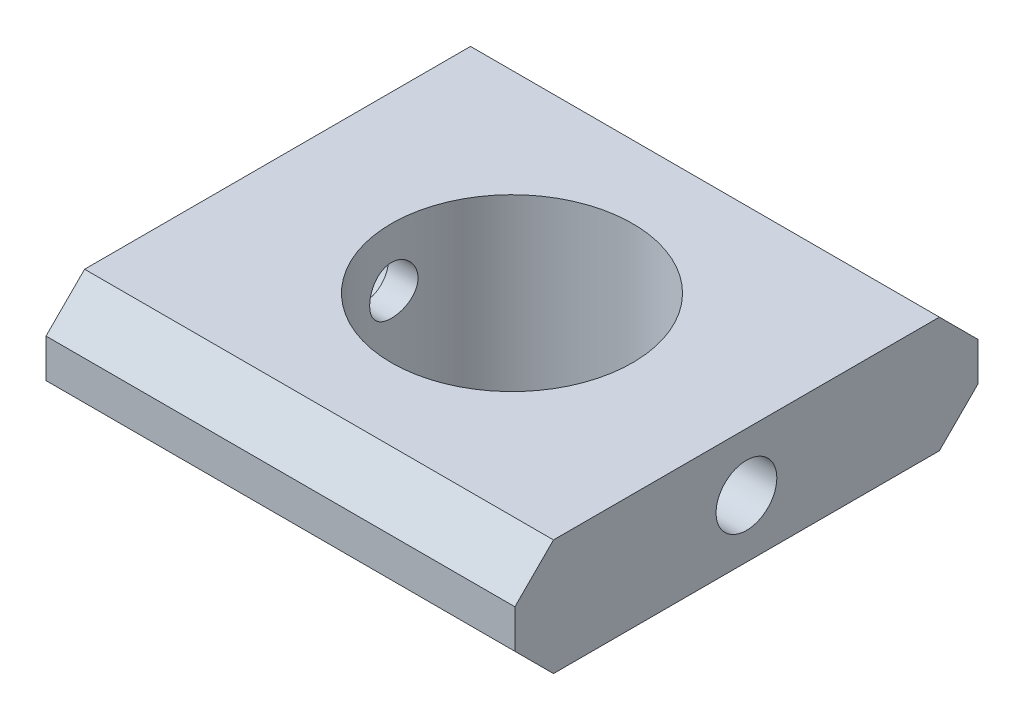
ISO-10303-21;
HEADER;
FILE_DESCRIPTION(('STEP AP214'),'2;1');
FILE_NAME('part.step','',(''),(''),'','','');
FILE_SCHEMA(('AUTOMOTIVE_DESIGN { 1 0 10303 214 1 1 1 1 }'));
ENDSEC;
DATA;
#1=APPLICATION_CONTEXT('core data for automotive mechanical design processes');
#2=APPLICATION_PROTOCOL_DEFINITION('international standard','automotive_design',2000,#1);
#3=PRODUCT_CONTEXT('',#1,'mechanical');
#4=PRODUCT('Part','Part','',(#3));
#5=PRODUCT_RELATED_PRODUCT_CATEGORY('part','',(#4));
#6=PRODUCT_DEFINITION_FORMATION('','',#4);
#7=PRODUCT_DEFINITION_CONTEXT('part definition',#1,'design');
#8=PRODUCT_DEFINITION('design','',#6,#7);
#9=PRODUCT_DEFINITION_SHAPE('','',#8);
#10=(LENGTH_UNIT() NAMED_UNIT(*) SI_UNIT(.MILLI.,.METRE.));
#11=(NAMED_UNIT(*) PLANE_ANGLE_UNIT() SI_UNIT($,.RADIAN.));
#12=(NAMED_UNIT(*) SI_UNIT($,.STERADIAN.) SOLID_ANGLE_UNIT());
#13=UNCERTAINTY_MEASURE_WITH_UNIT(LENGTH_MEASURE(1.E-05),#10,'distance_accuracy_value','');
#14=(GEOMETRIC_REPRESENTATION_CONTEXT(3) GLOBAL_UNCERTAINTY_ASSIGNED_CONTEXT((#13)) GLOBAL_UNIT_ASSIGNED_CONTEXT((#10,
#11,#12)) REPRESENTATION_CONTEXT('',''));
#15=CARTESIAN_POINT('',(0.,0.,0.));
#16=DIRECTION('',(0.,0.,1.));
#17=DIRECTION('',(1.,0.,0.));
#18=AXIS2_PLACEMENT_3D('',#15,#16,#17);
#19=CARTESIAN_POINT('',(-11.43,5.08,0.));
#20=DIRECTION('',(1.,0.,0.));
#21=DIRECTION('',(0.,0.,-1.));
#22=AXIS2_PLACEMENT_3D('',#19,#20,#21);
#23=CYLINDRICAL_SURFACE('',#22,1.59);
#24=CARTESIAN_POINT('',(-7.77661920438438,5.08,-1.59));
#25=CARTESIAN_POINT('',(-7.77662096169858,4.99165569814137,-1.58999673742606));
#26=CARTESIAN_POINT('',(-7.77814099174022,4.90327033451264,-1.58261205339776));
#27=CARTESIAN_POINT('',(-7.78404790873309,4.7290001860405,-1.55329317676019));
#28=CARTESIAN_POINT('',(-7.78843708600625,4.64311745620615,-1.53134736038898));
#29=CARTESIAN_POINT('',(-7.79956570286462,4.47639902921727,-1.47361421444193));
#30=CARTESIAN_POINT('',(-7.80630280027689,4.39555839670401,-1.43784067487579));
#31=CARTESIAN_POINT('',(-7.82136537014129,4.2410285133929,-1.35350533686951));
#32=CARTESIAN_POINT('',(-7.82969075484592,4.16733886786633,-1.30494424484212));
#33=CARTESIAN_POINT('',(-7.84712377724183,4.02815360249162,-1.19567795830234));
#34=CARTESIAN_POINT('',(-7.85624002124679,3.96277418805575,-1.13482608882808));
#35=CARTESIAN_POINT('',(-7.87415184947388,3.84307980879176,-1.00302250168016));
#36=CARTESIAN_POINT('',(-7.88294741114489,3.78876562086857,-0.932070075426086));
#37=CARTESIAN_POINT('',(-7.89931968524558,3.69229242287763,-0.781309793739316));
#38=CARTESIAN_POINT('',(-7.90688506638167,3.65024386176407,-0.701429924686753));
#39=CARTESIAN_POINT('',(-7.91984787984181,3.58020826391215,-0.535562093244011));
#40=CARTESIAN_POINT('',(-7.92524551573399,3.55221990674936,-0.449574705290251));
#41=CARTESIAN_POINT('',(-7.93320386994164,3.5114610030507,-0.275138695105856));
#42=CARTESIAN_POINT('',(-7.93580113858947,3.49849422432739,-0.18673762002717));
#43=CARTESIAN_POINT('',(-7.93799235664154,3.48753429993167,-0.0089791944779868));
#44=CARTESIAN_POINT('',(-7.9375865963237,3.4895397070223,0.0803780627325463));
#45=CARTESIAN_POINT('',(-7.93384579042366,3.50831843659183,0.256163840781249));
#46=CARTESIAN_POINT('',(-7.93055267384151,3.52488038331719,0.342615964440911));
#47=CARTESIAN_POINT('',(-7.92145446760435,3.57196676198371,0.511488589366731));
#48=CARTESIAN_POINT('',(-7.91564927721959,3.60249175382135,0.593908928817872));
#49=CARTESIAN_POINT('',(-7.90211012571788,3.67683341081758,0.752981121729428));
#50=CARTESIAN_POINT('',(-7.89436420882702,3.72073284491941,0.829593234308059));
#51=CARTESIAN_POINT('',(-7.87779742750117,3.8205159872375,0.974441776815427));
#52=CARTESIAN_POINT('',(-7.86897643905556,3.87640107857753,1.04267723866322));
#53=CARTESIAN_POINT('',(-7.85105179974367,3.99972859941557,1.17008996133495));
#54=CARTESIAN_POINT('',(-7.84194590330442,4.06735601634116,1.22908798673059));
#55=CARTESIAN_POINT('',(-7.8246240052146,4.21163688802009,1.33493469377689));
#56=CARTESIAN_POINT('',(-7.81640802050327,4.28829051452718,1.38178314418705));
#57=CARTESIAN_POINT('',(-7.80179176063344,4.44870583425385,1.46206295570915));
#58=CARTESIAN_POINT('',(-7.7953954314788,4.53248247104806,1.49546522225443));
#59=CARTESIAN_POINT('',(-7.78520054536421,4.70461668007597,1.54766704956374));
#60=CARTESIAN_POINT('',(-7.78140164867895,4.79297365160823,1.56646852004954));
#61=CARTESIAN_POINT('',(-7.776899826896,4.9701357017272,1.58866700511529));
#62=CARTESIAN_POINT('',(-7.77614488118252,5.05890705816794,1.59232288542368));
#63=CARTESIAN_POINT('',(-7.77767679220457,5.23579120494376,1.58482306306632));
#64=CARTESIAN_POINT('',(-7.77996347587569,5.32390403246134,1.57366820311082));
#65=CARTESIAN_POINT('',(-7.78727227241481,5.49609929458741,1.53708673753786));
#66=CARTESIAN_POINT('',(-7.79226784746582,5.58021235677643,1.51179851768536));
#67=CARTESIAN_POINT('',(-7.80440826951863,5.74300769537349,1.44781617185577));
#68=CARTESIAN_POINT('',(-7.81155329404093,5.82168952256211,1.40912093856921));
#69=CARTESIAN_POINT('',(-7.82730437770292,5.97252142915919,1.31883724897523));
#70=CARTESIAN_POINT('',(-7.83592831554456,6.0445726740321,1.26708685545947));
#71=CARTESIAN_POINT('',(-7.85361650028054,6.17906283804757,1.1523776459531));
#72=CARTESIAN_POINT('',(-7.86268079257145,6.24150076336584,1.0894176725658));
#73=CARTESIAN_POINT('',(-7.88039724451104,6.35597376368907,0.95291426442902));
#74=CARTESIAN_POINT('',(-7.88904090538654,6.40783378703113,0.879222747917812));
#75=CARTESIAN_POINT('',(-7.90479423887887,6.49843705928916,0.724022847352744));
#76=CARTESIAN_POINT('',(-7.91190397604201,6.53718086016452,0.642514792421235));
#77=CARTESIAN_POINT('',(-7.92375210636792,6.60019693409869,0.474455104223343));
#78=CARTESIAN_POINT('',(-7.92850394946289,6.62455144236795,0.387935296450241));
#79=CARTESIAN_POINT('',(-7.9351585826074,6.65835808717384,0.211928080344261));
#80=CARTESIAN_POINT('',(-7.93706171693614,6.6678120245185,0.122441031952056));
#81=CARTESIAN_POINT('',(-7.93779632680184,6.67147924162156,-0.0552885755404494));
#82=CARTESIAN_POINT('',(-7.93668084019349,6.66595567604688,-0.143525591370475));
#83=CARTESIAN_POINT('',(-7.93161509323687,6.64040584651601,-0.317786850844523));
#84=CARTESIAN_POINT('',(-7.92766486876366,6.62037976609661,-0.403811122477696));
#85=CARTESIAN_POINT('',(-7.9173750351448,6.56651048362984,-0.571040379319813));
#86=CARTESIAN_POINT('',(-7.91104091242172,6.53269899323981,-0.652255938575289));
#87=CARTESIAN_POINT('',(-7.89666521659159,6.45225199005601,-0.807898827963959));
#88=CARTESIAN_POINT('',(-7.88862350804772,6.40561545996019,-0.882325618977601));
#89=CARTESIAN_POINT('',(-7.87155268415944,6.29995502276108,-1.02357913217755));
#90=CARTESIAN_POINT('',(-7.86250969843789,6.24074290606327,-1.09026340923259));
#91=CARTESIAN_POINT('',(-7.84453778445209,6.11199867135766,-1.21283979622201));
#92=CARTESIAN_POINT('',(-7.83560888371442,6.04246411196333,-1.26872934585337));
#93=CARTESIAN_POINT('',(-7.81876977401614,5.89414688877661,-1.36870393319224));
#94=CARTESIAN_POINT('',(-7.81087162288458,5.81527236333747,-1.41265480759212));
#95=CARTESIAN_POINT('',(-7.79713562424148,5.65112160897835,-1.48660972162555));
#96=CARTESIAN_POINT('',(-7.79129591093387,5.56585126279958,-1.51662639926907));
#97=CARTESIAN_POINT('',(-7.78350225947505,5.41365812052904,-1.55604785479092));
#98=CARTESIAN_POINT('',(-7.78093713019266,5.34760267348395,-1.56875710044413));
#99=CARTESIAN_POINT('',(-7.7774949635756,5.21437271078559,-1.58573426750495));
#100=CARTESIAN_POINT('',(-7.77661786770043,5.14719823402143,-1.59000248164514));
#101=CARTESIAN_POINT('',(-7.77661920438438,5.08,-1.59));
#102=B_SPLINE_CURVE_WITH_KNOTS('',3,(#24,#25,#26,#27,#28,#29,#30,#31,#32,#33,#34,#35,#36,#37,
#38,#39,#40,#41,#42,#43,#44,#45,#46,#47,#48,#49,#50,#51,#52,#53,#54,#55,#56,#57,#58,#59,#60,#61,
#62,#63,#64,#65,#66,#67,#68,#69,#70,#71,#72,#73,#74,#75,#76,#77,#78,#79,#80,#81,#82,#83,#84,#85,
#86,#87,#88,#89,#90,#91,#92,#93,#94,#95,#96,#97,#98,#99,#100,#101),.UNSPECIFIED.,.T.,.F.,(4,2,2,
2,2,2,2,2,2,2,2,2,2,2,2,2,2,2,2,2,2,2,2,2,2,2,2,2,2,2,2,2,2,2,2,2,2,2,4),(0.,0.26478685726229,
0.52978534149597,0.79452022901363,1.05924049505601,1.32732943673117,1.59543719482143,
1.86588951935121,2.13631644036287,2.4031693595323,2.66999648457836,2.93301186074028,
3.19603778433601,3.46072572217729,3.72544422099207,3.99479112571707,4.26414315649354,
4.53407491255452,4.80397135674516,5.06923525054883,5.33448405185733,5.59718007478456,
5.85989779942501,6.12604997202833,6.39222964097622,6.66250934039284,6.93277766443319,
7.20148607024584,7.4701619988219,7.7341480199328,7.99813070022318,8.26150951629836,
8.52490923001892,8.79257053133888,9.0602952390544,9.33091457546815,9.60128798422443,
9.80270251715318,10.0041100649606),.UNSPECIFIED.);
#103=CARTESIAN_POINT('',(-7.77661920438438,5.08,-1.59));
#104=VERTEX_POINT('',#103);
#105=EDGE_CURVE('E216',#104,#104,#102,.T.);
#106=ORIENTED_EDGE('',*,*,#105,.F.);
#107=EDGE_LOOP('',(#106));
#108=FACE_BOUND('',#107,.T.);
#109=CARTESIAN_POINT('',(-9.73,5.08,0.));
#110=DIRECTION('',(-1.,0.,0.));
#111=DIRECTION('',(0.,0.,1.));
#112=AXIS2_PLACEMENT_3D('',#109,#110,#111);
#113=CIRCLE('',#112,1.59);
#114=CARTESIAN_POINT('',(-9.73,5.08,1.59));
#115=VERTEX_POINT('',#114);
#116=EDGE_CURVE('E323',#115,#115,#113,.F.);
#117=ORIENTED_EDGE('',*,*,#116,.F.);
#118=EDGE_LOOP('',(#117));
#119=FACE_BOUND('',#118,.T.);
#120=ADVANCED_FACE('F46',(#108,#119),#23,.F.);
#121=CARTESIAN_POINT('',(7.77661920438438,5.08,-1.59));
#122=CARTESIAN_POINT('',(7.77662096169858,5.16834430185864,-1.58999673742606));
#123=CARTESIAN_POINT('',(7.77814099174022,5.25672966548737,-1.58261205339776));
#124=CARTESIAN_POINT('',(7.78404790873309,5.43099981395951,-1.55329317676019));
#125=CARTESIAN_POINT('',(7.78843708600625,5.51688254379386,-1.53134736038898));
#126=CARTESIAN_POINT('',(7.79956570286462,5.68360097078273,-1.47361421444193));
#127=CARTESIAN_POINT('',(7.80630280027689,5.764441603296,-1.43784067487579));
#128=CARTESIAN_POINT('',(7.82136537014129,5.9189714866071,-1.35350533686951));
#129=CARTESIAN_POINT('',(7.82969075484592,5.99266113213368,-1.30494424484212));
#130=CARTESIAN_POINT('',(7.84712377724183,6.13184639750838,-1.19567795830234));
#131=CARTESIAN_POINT('',(7.85624002124679,6.19722581194425,-1.13482608882808));
#132=CARTESIAN_POINT('',(7.87415184947388,6.31692019120825,-1.00302250168016));
#133=CARTESIAN_POINT('',(7.88294741114489,6.37123437913144,-0.932070075426085));
#134=CARTESIAN_POINT('',(7.89931968524558,6.46770757712238,-0.781309793739316));
#135=CARTESIAN_POINT('',(7.90688506638167,6.50975613823593,-0.701429924686753));
#136=CARTESIAN_POINT('',(7.91984787984181,6.57979173608785,-0.535562093244011));
#137=CARTESIAN_POINT('',(7.92524551573399,6.60778009325064,-0.449574705290251));
#138=CARTESIAN_POINT('',(7.93320386994164,6.64853899694931,-0.275138695105857));
#139=CARTESIAN_POINT('',(7.93580113858947,6.66150577567261,-0.18673762002717));
#140=CARTESIAN_POINT('',(7.93799235664154,6.67246570006833,-0.00897919447798719));
#141=CARTESIAN_POINT('',(7.9375865963237,6.67046029297771,0.0803780627325458));
#142=CARTESIAN_POINT('',(7.93384579042366,6.65168156340817,0.256163840781249));
#143=CARTESIAN_POINT('',(7.93055267384151,6.63511961668281,0.342615964440911));
#144=CARTESIAN_POINT('',(7.92145446760435,6.58803323801629,0.511488589366731));
#145=CARTESIAN_POINT('',(7.91564927721959,6.55750824617865,0.593908928817872));
#146=CARTESIAN_POINT('',(7.90211012571788,6.48316658918243,0.752981121729428));
#147=CARTESIAN_POINT('',(7.89436420882702,6.43926715508059,0.82959323430806));
#148=CARTESIAN_POINT('',(7.87779742750117,6.33948401276251,0.974441776815427));
#149=CARTESIAN_POINT('',(7.86897643905556,6.28359892142248,1.04267723866322));
#150=CARTESIAN_POINT('',(7.85105179974367,6.16027140058444,1.17008996133495));
#151=CARTESIAN_POINT('',(7.84194590330442,6.09264398365885,1.22908798673059));
#152=CARTESIAN_POINT('',(7.8246240052146,5.94836311197991,1.33493469377689));
#153=CARTESIAN_POINT('',(7.81640802050327,5.87170948547283,1.38178314418705));
#154=CARTESIAN_POINT('',(7.80179176063344,5.71129416574616,1.46206295570915));
#155=CARTESIAN_POINT('',(7.7953954314788,5.62751752895195,1.49546522225443));
#156=CARTESIAN_POINT('',(7.78520054536421,5.45538331992403,1.54766704956374));
#157=CARTESIAN_POINT('',(7.78140164867895,5.36702634839178,1.56646852004954));
#158=CARTESIAN_POINT('',(7.776899826896,5.18986429827281,1.58866700511529));
#159=CARTESIAN_POINT('',(7.77614488118252,5.10109294183206,1.59232288542368));
#160=CARTESIAN_POINT('',(7.77767679220457,4.92420879505625,1.58482306306632));
#161=CARTESIAN_POINT('',(7.77996347587569,4.83609596753867,1.57366820311082));
#162=CARTESIAN_POINT('',(7.78727227241481,4.66390070541259,1.53708673753786));
#163=CARTESIAN_POINT('',(7.79226784746582,4.57978764322358,1.51179851768536));
#164=CARTESIAN_POINT('',(7.80440826951863,4.41699230462652,1.44781617185577));
#165=CARTESIAN_POINT('',(7.81155329404093,4.3383104774379,1.40912093856921));
#166=CARTESIAN_POINT('',(7.82730437770292,4.18747857084082,1.31883724897523));
#167=CARTESIAN_POINT('',(7.83592831554456,4.11542732596791,1.26708685545947));
#168=CARTESIAN_POINT('',(7.85361650028054,3.98093716195243,1.1523776459531));
#169=CARTESIAN_POINT('',(7.86268079257145,3.91849923663416,1.0894176725658));
#170=CARTESIAN_POINT('',(7.88039724451104,3.80402623631093,0.952914264429019));
#171=CARTESIAN_POINT('',(7.88904090538654,3.75216621296887,0.879222747917812));
#172=CARTESIAN_POINT('',(7.90479423887887,3.66156294071084,0.724022847352744));
#173=CARTESIAN_POINT('',(7.91190397604201,3.62281913983549,0.642514792421235));
#174=CARTESIAN_POINT('',(7.92375210636792,3.55980306590132,0.474455104223343));
#175=CARTESIAN_POINT('',(7.92850394946289,3.53544855763206,0.387935296450242));
#176=CARTESIAN_POINT('',(7.9351585826074,3.50164191282616,0.211928080344262));
#177=CARTESIAN_POINT('',(7.93706171693614,3.4921879754815,0.122441031952056));
#178=CARTESIAN_POINT('',(7.93779632680184,3.48852075837844,-0.0552885755404494));
#179=CARTESIAN_POINT('',(7.93668084019349,3.49404432395313,-0.143525591370475));
#180=CARTESIAN_POINT('',(7.93161509323687,3.519594153484,-0.317786850844523));
#181=CARTESIAN_POINT('',(7.92766486876366,3.5396202339034,-0.403811122477696));
#182=CARTESIAN_POINT('',(7.9173750351448,3.59348951637016,-0.571040379319813));
#183=CARTESIAN_POINT('',(7.91104091242172,3.6273010067602,-0.652255938575289));
#184=CARTESIAN_POINT('',(7.89666521659159,3.707748009944,-0.807898827963959));
#185=CARTESIAN_POINT('',(7.88862350804772,3.75438454003981,-0.8823256189776));
#186=CARTESIAN_POINT('',(7.87155268415944,3.86004497723892,-1.02357913217755));
#187=CARTESIAN_POINT('',(7.86250969843789,3.91925709393674,-1.09026340923259));
#188=CARTESIAN_POINT('',(7.84453778445209,4.04800132864235,-1.21283979622201));
#189=CARTESIAN_POINT('',(7.83560888371442,4.11753588803668,-1.26872934585337));
#190=CARTESIAN_POINT('',(7.81876977401614,4.26585311122339,-1.36870393319224));
#191=CARTESIAN_POINT('',(7.81087162288458,4.34472763666254,-1.41265480759212));
#192=CARTESIAN_POINT('',(7.79713562424148,4.50887839102166,-1.48660972162555));
#193=CARTESIAN_POINT('',(7.79129591093387,4.59414873720043,-1.51662639926907));
#194=CARTESIAN_POINT('',(7.78350225947505,4.74634187947096,-1.55604785479092));
#195=CARTESIAN_POINT('',(7.78093713019266,4.81239732651606,-1.56875710044413));
#196=CARTESIAN_POINT('',(7.7774949635756,4.94562728921442,-1.58573426750495));
#197=CARTESIAN_POINT('',(7.77661786770043,5.01280176597858,-1.59000248164514));
#198=CARTESIAN_POINT('',(7.77661920438438,5.08,-1.59));
#199=B_SPLINE_CURVE_WITH_KNOTS('',3,(#121,#122,#123,#124,#125,#126,#127,#128,#129,#130,#131,
#132,#133,#134,#135,#136,#137,#138,#139,#140,#141,#142,#143,#144,#145,#146,#147,#148,#149,#150,
#151,#152,#153,#154,#155,#156,#157,#158,#159,#160,#161,#162,#163,#164,#165,#166,#167,#168,#169,
#170,#171,#172,#173,#174,#175,#176,#177,#178,#179,#180,#181,#182,#183,#184,#185,#186,#187,#188,
#189,#190,#191,#192,#193,#194,#195,#196,#197,#198),.UNSPECIFIED.,.T.,.F.,(4,2,2,2,2,2,2,2,2,2,2,
2,2,2,2,2,2,2,2,2,2,2,2,2,2,2,2,2,2,2,2,2,2,2,2,2,2,2,4),(0.,0.26478685726229,0.52978534149597,
0.79452022901363,1.05924049505601,1.32732943673117,1.59543719482143,1.86588951935121,
2.13631644036287,2.4031693595323,2.66999648457836,2.93301186074028,3.19603778433601,
3.46072572217729,3.72544422099207,3.99479112571707,4.26414315649354,4.53407491255452,
4.80397135674516,5.06923525054883,5.33448405185733,5.59718007478456,5.85989779942501,
6.12604997202833,6.39222964097622,6.66250934039284,6.93277766443319,7.20148607024584,
7.4701619988219,7.7341480199328,7.99813070022318,8.26150951629836,8.52490923001892,
8.79257053133888,9.0602952390544,9.33091457546815,9.60128798422443,9.80270251715318,
10.0041100649606),.UNSPECIFIED.);
#200=CARTESIAN_POINT('',(7.77661920438438,5.08,-1.59));
#201=VERTEX_POINT('',#200);
#202=EDGE_CURVE('E207',#201,#201,#199,.T.);
#203=ORIENTED_EDGE('',*,*,#202,.F.);
#204=EDGE_LOOP('',(#203));
#205=FACE_BOUND('',#204,.T.);
#206=CARTESIAN_POINT('',(9.73,5.08,0.));
#207=DIRECTION('',(1.,0.,0.));
#208=DIRECTION('',(0.,0.,-1.));
#209=AXIS2_PLACEMENT_3D('',#206,#207,#208);
#210=CIRCLE('',#209,1.59);
#211=CARTESIAN_POINT('',(9.73,5.08,-1.59));
#212=VERTEX_POINT('',#211);
#213=EDGE_CURVE('E317',#212,#212,#210,.F.);
#214=ORIENTED_EDGE('',*,*,#213,.F.);
#215=EDGE_LOOP('',(#214));
#216=FACE_BOUND('',#215,.T.);
#217=ADVANCED_FACE('F229',(#205,#216),#23,.F.);
#218=CARTESIAN_POINT('',(0.,1.27,0.));
#219=DIRECTION('',(0.,1.,0.));
#220=DIRECTION('',(0.,0.,1.));
#221=AXIS2_PLACEMENT_3D('',#218,#219,#220);
#222=PLANE('',#221);
#223=CARTESIAN_POINT('',(0.,1.27,0.));
#224=DIRECTION('',(0.,1.,0.));
#225=DIRECTION('',(0.,0.,1.));
#226=AXIS2_PLACEMENT_3D('',#223,#224,#225);
#227=CIRCLE('',#226,10.16);
#228=CARTESIAN_POINT('',(0.,1.27,10.16));
#229=VERTEX_POINT('',#228);
#230=EDGE_CURVE('E276',#229,#229,#227,.T.);
#231=ORIENTED_EDGE('',*,*,#230,.T.);
#232=EDGE_LOOP('',(#231));
#233=FACE_BOUND('',#232,.T.);
#234=DIRECTION('',(1.,0.,0.));
#235=VECTOR('',#234,1.);
#236=CARTESIAN_POINT('',(-15.24,1.27,-12.7));
#237=LINE('',#236,#235);
#238=CARTESIAN_POINT('',(-15.43,1.27,-12.7));
#239=VERTEX_POINT('',#238);
#240=CARTESIAN_POINT('',(15.43,1.27,-12.7));
#241=VERTEX_POINT('',#240);
#242=EDGE_CURVE('E172',#239,#241,#237,.T.);
#243=ORIENTED_EDGE('',*,*,#242,.T.);
#244=DIRECTION('',(0.,0.,-1.));
#245=VECTOR('',#244,1.);
#246=CARTESIAN_POINT('',(15.43,1.27,12.7));
#247=LINE('',#246,#245);
#248=CARTESIAN_POINT('',(15.43,1.27,12.7));
#249=VERTEX_POINT('',#248);
#250=EDGE_CURVE('E195',#249,#241,#247,.T.);
#251=ORIENTED_EDGE('',*,*,#250,.F.);
#252=DIRECTION('',(1.,0.,0.));
#253=VECTOR('',#252,1.);
#254=CARTESIAN_POINT('',(-15.24,1.27,12.7));
#255=LINE('',#254,#253);
#256=CARTESIAN_POINT('',(-15.43,1.27,12.7));
#257=VERTEX_POINT('',#256);
#258=EDGE_CURVE('E158',#257,#249,#255,.T.);
#259=ORIENTED_EDGE('',*,*,#258,.F.);
#260=DIRECTION('',(0.,0.,-1.));
#261=VECTOR('',#260,1.);
#262=CARTESIAN_POINT('',(-15.43,1.27,12.7));
#263=LINE('',#262,#261);
#264=EDGE_CURVE('E174',#257,#239,#263,.T.);
#265=ORIENTED_EDGE('',*,*,#264,.T.);
#266=EDGE_LOOP('',(#243,#251,#259,#265));
#267=FACE_BOUND('',#266,.T.);
#268=ADVANCED_FACE('F265',(#233,#267),#222,.F.);
#269=CARTESIAN_POINT('',(-15.24,3.81,15.24));
#270=DIRECTION('',(0.,0.707106781186544,-0.707106781186551));
#271=DIRECTION('',(0.,0.707106781186551,0.707106781186544));
#272=AXIS2_PLACEMENT_3D('',#269,#270,#271);
#273=PLANE('',#272);
#274=ORIENTED_EDGE('',*,*,#258,.T.);
#275=DIRECTION('',(0.,-0.707106781186549,-0.707106781186546));
#276=VECTOR('',#275,1.);
#277=CARTESIAN_POINT('',(15.43,3.81,15.24));
#278=LINE('',#277,#276);
#279=CARTESIAN_POINT('',(15.43,3.81,15.24));
#280=VERTEX_POINT('',#279);
#281=EDGE_CURVE('E191',#280,#249,#278,.T.);
#282=ORIENTED_EDGE('',*,*,#281,.F.);
#283=DIRECTION('',(1.,0.,0.));
#284=VECTOR('',#283,1.);
#285=CARTESIAN_POINT('',(-15.24,3.81,15.24));
#286=LINE('',#285,#284);
#287=CARTESIAN_POINT('',(-15.43,3.81,15.24));
#288=VERTEX_POINT('',#287);
#289=EDGE_CURVE('E157',#288,#280,#286,.T.);
#290=ORIENTED_EDGE('',*,*,#289,.F.);
#291=DIRECTION('',(0.,-0.707106781186549,-0.707106781186546));
#292=VECTOR('',#291,1.);
#293=CARTESIAN_POINT('',(-15.43,3.81,15.24));
#294=LINE('',#293,#292);
#295=EDGE_CURVE('E177',#288,#257,#294,.T.);
#296=ORIENTED_EDGE('',*,*,#295,.T.);
#297=EDGE_LOOP('',(#274,#282,#290,#296));
#298=FACE_BOUND('',#297,.T.);
#299=ADVANCED_FACE('F263',(#298),#273,.F.);
#300=CARTESIAN_POINT('',(-15.24,3.81,-15.24));
#301=DIRECTION('',(0.,-0.707106781186544,-0.707106781186551));
#302=DIRECTION('',(0.,0.707106781186551,-0.707106781186544));
#303=AXIS2_PLACEMENT_3D('',#300,#301,#302);
#304=PLANE('',#303);
#305=DIRECTION('',(-1.,0.,0.));
#306=VECTOR('',#305,1.);
#307=CARTESIAN_POINT('',(-15.24,3.81,-15.24));
#308=LINE('',#307,#306);
#309=CARTESIAN_POINT('',(15.43,3.81,-15.24));
#310=VERTEX_POINT('',#309);
#311=CARTESIAN_POINT('',(-15.43,3.81,-15.24));
#312=VERTEX_POINT('',#311);
#313=EDGE_CURVE('E147',#310,#312,#308,.T.);
#314=ORIENTED_EDGE('',*,*,#313,.F.);
#315=DIRECTION('',(0.,0.707106781186551,-0.707106781186544));
#316=VECTOR('',#315,1.);
#317=CARTESIAN_POINT('',(15.43,1.27,-12.7));
#318=LINE('',#317,#316);
#319=EDGE_CURVE('E199',#241,#310,#318,.T.);
#320=ORIENTED_EDGE('',*,*,#319,.F.);
#321=ORIENTED_EDGE('',*,*,#242,.F.);
#322=DIRECTION('',(0.,0.707106781186551,-0.707106781186544));
#323=VECTOR('',#322,1.);
#324=CARTESIAN_POINT('',(-15.43,1.27,-12.7));
#325=LINE('',#324,#323);
#326=EDGE_CURVE('E165',#239,#312,#325,.T.);
#327=ORIENTED_EDGE('',*,*,#326,.T.);
#328=EDGE_LOOP('',(#314,#320,#321,#327));
#329=FACE_BOUND('',#328,.T.);
#330=ADVANCED_FACE('F171',(#329),#304,.T.);
#331=CARTESIAN_POINT('',(0.,-2.54,0.));
#332=DIRECTION('',(0.,1.,0.));
#333=DIRECTION('',(0.,0.,1.));
#334=AXIS2_PLACEMENT_3D('',#331,#332,#333);
#335=PLANE('',#334);
#336=CARTESIAN_POINT('',(0.,-2.54,0.));
#337=DIRECTION('',(0.,1.,0.));
#338=DIRECTION('',(0.,0.,1.));
#339=AXIS2_PLACEMENT_3D('',#336,#337,#338);
#340=CIRCLE('',#339,7.9375);
#341=CARTESIAN_POINT('',(0.,-2.54,7.9375));
#342=VERTEX_POINT('',#341);
#343=EDGE_CURVE('E292',#342,#342,#340,.T.);
#344=ORIENTED_EDGE('',*,*,#343,.T.);
#345=EDGE_LOOP('',(#344));
#346=FACE_BOUND('',#345,.T.);
#347=DIRECTION('',(0.,0.,-1.));
#348=VECTOR('',#347,1.);
#349=CARTESIAN_POINT('',(8.89,-2.54,0.));
#350=LINE('',#349,#348);
#351=CARTESIAN_POINT('',(8.89,-2.54,4.91868884968343));
#352=VERTEX_POINT('',#351);
#353=CARTESIAN_POINT('',(8.89,-2.54,-4.91868884968343));
#354=VERTEX_POINT('',#353);
#355=EDGE_CURVE('E392',#352,#354,#350,.T.);
#356=ORIENTED_EDGE('',*,*,#355,.F.);
#357=CARTESIAN_POINT('',(0.,-2.54,0.));
#358=DIRECTION('',(0.,1.,0.));
#359=DIRECTION('',(0.,0.,1.));
#360=AXIS2_PLACEMENT_3D('',#357,#358,#359);
#361=CIRCLE('',#360,10.16);
#362=CARTESIAN_POINT('',(4.91868884968343,-2.54,8.89));
#363=VERTEX_POINT('',#362);
#364=EDGE_CURVE('E306',#363,#352,#361,.T.);
#365=ORIENTED_EDGE('',*,*,#364,.F.);
#366=DIRECTION('',(-1.,0.,0.));
#367=VECTOR('',#366,1.);
#368=CARTESIAN_POINT('',(0.,-2.54,8.89));
#369=LINE('',#368,#367);
#370=CARTESIAN_POINT('',(-4.91868884968343,-2.54,8.89));
#371=VERTEX_POINT('',#370);
#372=EDGE_CURVE('E279',#363,#371,#369,.T.);
#373=ORIENTED_EDGE('',*,*,#372,.T.);
#374=CARTESIAN_POINT('',(-8.89,-2.54,4.91868884968343));
#375=VERTEX_POINT('',#374);
#376=EDGE_CURVE('E305',#375,#371,#361,.T.);
#377=ORIENTED_EDGE('',*,*,#376,.F.);
#378=DIRECTION('',(0.,0.,-1.));
#379=VECTOR('',#378,1.);
#380=CARTESIAN_POINT('',(-8.89,-2.54,0.));
#381=LINE('',#380,#379);
#382=CARTESIAN_POINT('',(-8.89,-2.54,-4.91868884968343));
#383=VERTEX_POINT('',#382);
#384=EDGE_CURVE('E436',#375,#383,#381,.T.);
#385=ORIENTED_EDGE('',*,*,#384,.T.);
#386=CARTESIAN_POINT('',(-4.91868884968343,-2.54,-8.89));
#387=VERTEX_POINT('',#386);
#388=EDGE_CURVE('E312',#387,#383,#361,.T.);
#389=ORIENTED_EDGE('',*,*,#388,.F.);
#390=DIRECTION('',(-1.,0.,0.));
#391=VECTOR('',#390,1.);
#392=CARTESIAN_POINT('',(0.,-2.54,-8.89));
#393=LINE('',#392,#391);
#394=CARTESIAN_POINT('',(4.91868884968343,-2.54,-8.89));
#395=VERTEX_POINT('',#394);
#396=EDGE_CURVE('E412',#395,#387,#393,.T.);
#397=ORIENTED_EDGE('',*,*,#396,.F.);
#398=EDGE_CURVE('E311',#354,#395,#361,.T.);
#399=ORIENTED_EDGE('',*,*,#398,.F.);
#400=EDGE_LOOP('',(#356,#365,#373,#377,#385,#389,#397,#399));
#401=FACE_BOUND('',#400,.T.);
#402=ADVANCED_FACE('F262',(#346,#401),#335,.F.);
#403=CARTESIAN_POINT('',(0.,-2.54,0.));
#404=DIRECTION('',(0.,1.,0.));
#405=DIRECTION('',(0.,0.,1.));
#406=AXIS2_PLACEMENT_3D('',#403,#404,#405);
#407=CYLINDRICAL_SURFACE('',#406,10.16);
#408=CARTESIAN_POINT('',(0.,-1.27,0.));
#409=DIRECTION('',(0.,1.,0.));
#410=DIRECTION('',(0.,0.,1.));
#411=AXIS2_PLACEMENT_3D('',#408,#409,#410);
#412=CIRCLE('',#411,10.16);
#413=CARTESIAN_POINT('',(10.16,-1.27,0.));
#414=VERTEX_POINT('',#413);
#415=CARTESIAN_POINT('',(0.,-1.27,-10.16));
#416=VERTEX_POINT('',#415);
#417=EDGE_CURVE('E301',#414,#416,#412,.T.);
#418=ORIENTED_EDGE('',*,*,#417,.F.);
#419=CARTESIAN_POINT('',(0.,-11.43,0.));
#420=DIRECTION('',(0.707106781186547,-0.707106781186548,0.));
#421=DIRECTION('',(0.707106781186548,0.707106781186547,0.));
#422=AXIS2_PLACEMENT_3D('',#419,#420,#421);
#423=ELLIPSE('',#422,14.3684097937106,10.16);
#424=EDGE_CURVE('E398',#414,#354,#423,.F.);
#425=ORIENTED_EDGE('',*,*,#424,.T.);
#426=ORIENTED_EDGE('',*,*,#398,.T.);
#427=CARTESIAN_POINT('',(0.,-11.43,0.));
#428=DIRECTION('',(0.,-0.707106781186548,-0.707106781186547));
#429=DIRECTION('',(0.,0.707106781186547,-0.707106781186548));
#430=AXIS2_PLACEMENT_3D('',#427,#428,#429);
#431=ELLIPSE('',#430,14.3684097937106,10.16);
#432=EDGE_CURVE('E431',#395,#416,#431,.F.);
#433=ORIENTED_EDGE('',*,*,#432,.T.);
#434=EDGE_LOOP('',(#418,#425,#426,#433));
#435=FACE_BOUND('',#434,.T.);
#436=ADVANCED_FACE('F378',(#435),#407,.T.);
#437=ORIENTED_EDGE('',*,*,#364,.T.);
#438=EDGE_CURVE('E404',#352,#414,#423,.F.);
#439=ORIENTED_EDGE('',*,*,#438,.T.);
#440=CARTESIAN_POINT('',(0.,-1.27,10.16));
#441=VERTEX_POINT('',#440);
#442=EDGE_CURVE('E297',#441,#414,#412,.T.);
#443=ORIENTED_EDGE('',*,*,#442,.F.);
#444=CARTESIAN_POINT('',(0.,-11.43,0.));
#445=DIRECTION('',(0.,0.707106781186548,-0.707106781186547));
#446=DIRECTION('',(0.,0.707106781186547,0.707106781186548));
#447=AXIS2_PLACEMENT_3D('',#444,#445,#446);
#448=ELLIPSE('',#447,14.3684097937106,10.16);
#449=EDGE_CURVE('E407',#363,#441,#448,.F.);
#450=ORIENTED_EDGE('',*,*,#449,.F.);
#451=EDGE_LOOP('',(#437,#439,#443,#450));
#452=FACE_BOUND('',#451,.T.);
#453=ADVANCED_FACE('F385',(#452),#407,.T.);
#454=CARTESIAN_POINT('',(0.,-11.43,0.));
#455=DIRECTION('',(0.707106781186547,0.707106781186548,0.));
#456=DIRECTION('',(-0.707106781186548,0.707106781186547,0.));
#457=AXIS2_PLACEMENT_3D('',#454,#455,#456);
#458=ELLIPSE('',#457,14.3684097937106,10.16);
#459=CARTESIAN_POINT('',(-10.16,-1.27,0.));
#460=VERTEX_POINT('',#459);
#461=EDGE_CURVE('E440',#460,#383,#458,.F.);
#462=ORIENTED_EDGE('',*,*,#461,.F.);
#463=EDGE_CURVE('E302',#416,#460,#412,.T.);
#464=ORIENTED_EDGE('',*,*,#463,.F.);
#465=EDGE_CURVE('E416',#416,#387,#431,.F.);
#466=ORIENTED_EDGE('',*,*,#465,.T.);
#467=ORIENTED_EDGE('',*,*,#388,.T.);
#468=EDGE_LOOP('',(#462,#464,#466,#467));
#469=FACE_BOUND('',#468,.T.);
#470=ADVANCED_FACE('F376',(#469),#407,.T.);
#471=EDGE_CURVE('E397',#375,#460,#458,.F.);
#472=ORIENTED_EDGE('',*,*,#471,.F.);
#473=ORIENTED_EDGE('',*,*,#376,.T.);
#474=EDGE_CURVE('E411',#441,#371,#448,.F.);
#475=ORIENTED_EDGE('',*,*,#474,.F.);
#476=EDGE_CURVE('E316',#460,#441,#412,.T.);
#477=ORIENTED_EDGE('',*,*,#476,.F.);
#478=EDGE_LOOP('',(#472,#473,#475,#477));
#479=FACE_BOUND('',#478,.T.);
#480=ADVANCED_FACE('F370',(#479),#407,.T.);
#481=CARTESIAN_POINT('',(0.,0.,0.));
#482=DIRECTION('',(0.,1.,0.));
#483=DIRECTION('',(0.,0.,1.));
#484=AXIS2_PLACEMENT_3D('',#481,#482,#483);
#485=TOROIDAL_SURFACE('',#484,10.16,1.27);
#486=ORIENTED_EDGE('',*,*,#230,.F.);
#487=EDGE_LOOP('',(#486));
#488=FACE_BOUND('',#487,.T.);
#489=CARTESIAN_POINT('',(0.,0.,0.));
#490=DIRECTION('',(0.,1.,0.));
#491=DIRECTION('',(0.,0.,1.));
#492=AXIS2_PLACEMENT_3D('',#489,#490,#491);
#493=CIRCLE('',#492,8.89);
#494=CARTESIAN_POINT('',(0.,0.,8.89));
#495=VERTEX_POINT('',#494);
#496=EDGE_CURVE('E296',#495,#495,#493,.F.);
#497=ORIENTED_EDGE('',*,*,#496,.F.);
#498=EDGE_LOOP('',(#497));
#499=FACE_BOUND('',#498,.T.);
#500=ADVANCED_FACE('F366',(#488,#499),#485,.F.);
#501=CARTESIAN_POINT('',(0.,0.,0.));
#502=DIRECTION('',(0.,1.,0.));
#503=DIRECTION('',(0.,0.,1.));
#504=AXIS2_PLACEMENT_3D('',#501,#502,#503);
#505=TOROIDAL_SURFACE('',#504,10.16,1.27);
#506=ORIENTED_EDGE('',*,*,#442,.T.);
#507=ORIENTED_EDGE('',*,*,#417,.T.);
#508=ORIENTED_EDGE('',*,*,#463,.T.);
#509=ORIENTED_EDGE('',*,*,#476,.T.);
#510=EDGE_LOOP('',(#506,#507,#508,#509));
#511=FACE_BOUND('',#510,.T.);
#512=ORIENTED_EDGE('',*,*,#496,.T.);
#513=EDGE_LOOP('',(#512));
#514=FACE_BOUND('',#513,.T.);
#515=ADVANCED_FACE('F369',(#511,#514),#505,.F.);
#516=CARTESIAN_POINT('',(0.,-2.54,0.));
#517=DIRECTION('',(0.,1.,0.));
#518=DIRECTION('',(0.,0.,1.));
#519=AXIS2_PLACEMENT_3D('',#516,#517,#518);
#520=CYLINDRICAL_SURFACE('',#519,7.9375);
#521=ORIENTED_EDGE('',*,*,#105,.T.);
#522=EDGE_LOOP('',(#521));
#523=FACE_BOUND('',#522,.T.);
#524=ORIENTED_EDGE('',*,*,#202,.T.);
#525=EDGE_LOOP('',(#524));
#526=FACE_BOUND('',#525,.T.);
#527=ORIENTED_EDGE('',*,*,#343,.F.);
#528=EDGE_LOOP('',(#527));
#529=FACE_BOUND('',#528,.T.);
#530=CARTESIAN_POINT('',(0.,8.89,0.));
#531=DIRECTION('',(0.,1.,0.));
#532=DIRECTION('',(0.,0.,1.));
#533=AXIS2_PLACEMENT_3D('',#530,#531,#532);
#534=CIRCLE('',#533,7.9375);
#535=CARTESIAN_POINT('',(0.,8.89,7.9375));
#536=VERTEX_POINT('',#535);
#537=EDGE_CURVE('E448',#536,#536,#534,.F.);
#538=ORIENTED_EDGE('',*,*,#537,.F.);
#539=EDGE_LOOP('',(#538));
#540=FACE_BOUND('',#539,.T.);
#541=ADVANCED_FACE('F221',(#523,#526,#529,#540),#520,.F.);
#542=CARTESIAN_POINT('',(-15.24,3.81,15.24));
#543=DIRECTION('',(0.,0.707106781186548,-0.707106781186547));
#544=DIRECTION('',(0.,0.707106781186547,0.707106781186548));
#545=AXIS2_PLACEMENT_3D('',#542,#543,#544);
#546=PLANE('',#545);
#547=ORIENTED_EDGE('',*,*,#449,.T.);
#548=ORIENTED_EDGE('',*,*,#474,.T.);
#549=ORIENTED_EDGE('',*,*,#372,.F.);
#550=EDGE_LOOP('',(#547,#548,#549));
#551=FACE_BOUND('',#550,.T.);
#552=ADVANCED_FACE('F255',(#551),#546,.F.);
#553=CARTESIAN_POINT('',(-15.24,3.81,-15.24));
#554=DIRECTION('',(0.,-0.707106781186548,-0.707106781186547));
#555=DIRECTION('',(0.,0.707106781186547,-0.707106781186548));
#556=AXIS2_PLACEMENT_3D('',#553,#554,#555);
#557=PLANE('',#556);
#558=ORIENTED_EDGE('',*,*,#396,.T.);
#559=ORIENTED_EDGE('',*,*,#465,.F.);
#560=ORIENTED_EDGE('',*,*,#432,.F.);
#561=EDGE_LOOP('',(#558,#559,#560));
#562=FACE_BOUND('',#561,.T.);
#563=ADVANCED_FACE('F251',(#562),#557,.T.);
#564=CARTESIAN_POINT('',(-15.24,3.81,-15.24));
#565=DIRECTION('',(0.707106781186547,0.707106781186548,0.));
#566=DIRECTION('',(-0.707106781186548,0.707106781186547,0.));
#567=AXIS2_PLACEMENT_3D('',#564,#565,#566);
#568=PLANE('',#567);
#569=ORIENTED_EDGE('',*,*,#471,.T.);
#570=ORIENTED_EDGE('',*,*,#461,.T.);
#571=ORIENTED_EDGE('',*,*,#384,.F.);
#572=EDGE_LOOP('',(#569,#570,#571));
#573=FACE_BOUND('',#572,.T.);
#574=ADVANCED_FACE('F247',(#573),#568,.F.);
#575=CARTESIAN_POINT('',(15.24,3.81,-15.24));
#576=DIRECTION('',(0.707106781186547,-0.707106781186548,0.));
#577=DIRECTION('',(0.707106781186548,0.707106781186547,0.));
#578=AXIS2_PLACEMENT_3D('',#575,#576,#577);
#579=PLANE('',#578);
#580=ORIENTED_EDGE('',*,*,#355,.T.);
#581=ORIENTED_EDGE('',*,*,#424,.F.);
#582=ORIENTED_EDGE('',*,*,#438,.F.);
#583=EDGE_LOOP('',(#580,#581,#582));
#584=FACE_BOUND('',#583,.T.);
#585=ADVANCED_FACE('F243',(#584),#579,.T.);
#586=CARTESIAN_POINT('',(0.,8.89,15.24));
#587=DIRECTION('',(0.,0.,-1.));
#588=DIRECTION('',(-1.,0.,0.));
#589=AXIS2_PLACEMENT_3D('',#586,#587,#588);
#590=PLANE('',#589);
#591=DIRECTION('',(0.,-1.,0.));
#592=VECTOR('',#591,1.);
#593=CARTESIAN_POINT('',(15.43,8.89,15.24));
#594=LINE('',#593,#592);
#595=CARTESIAN_POINT('',(15.43,6.34999999999999,15.24));
#596=VERTEX_POINT('',#595);
#597=EDGE_CURVE('E188',#596,#280,#594,.T.);
#598=ORIENTED_EDGE('',*,*,#597,.F.);
#599=DIRECTION('',(-1.,0.,0.));
#600=VECTOR('',#599,1.);
#601=CARTESIAN_POINT('',(-15.43,6.34999999999999,15.24));
#602=LINE('',#601,#600);
#603=CARTESIAN_POINT('',(-15.43,6.34999999999999,15.24));
#604=VERTEX_POINT('',#603);
#605=EDGE_CURVE('E11',#596,#604,#602,.T.);
#606=ORIENTED_EDGE('',*,*,#605,.T.);
#607=DIRECTION('',(0.,-1.,0.));
#608=VECTOR('',#607,1.);
#609=CARTESIAN_POINT('',(-15.43,8.89,15.24));
#610=LINE('',#609,#608);
#611=EDGE_CURVE('E498',#604,#288,#610,.T.);
#612=ORIENTED_EDGE('',*,*,#611,.T.);
#613=ORIENTED_EDGE('',*,*,#289,.T.);
#614=EDGE_LOOP('',(#598,#606,#612,#613));
#615=FACE_BOUND('',#614,.T.);
#616=ADVANCED_FACE('F240',(#615),#590,.F.);
#617=CARTESIAN_POINT('',(0.,8.89,-15.24));
#618=DIRECTION('',(0.,0.,1.));
#619=DIRECTION('',(1.,0.,0.));
#620=AXIS2_PLACEMENT_3D('',#617,#618,#619);
#621=PLANE('',#620);
#622=DIRECTION('',(0.,1.,0.));
#623=VECTOR('',#622,1.);
#624=CARTESIAN_POINT('',(-15.43,3.81,-15.24));
#625=LINE('',#624,#623);
#626=CARTESIAN_POINT('',(-15.43,6.34999999999999,-15.24));
#627=VERTEX_POINT('',#626);
#628=EDGE_CURVE('E150',#312,#627,#625,.T.);
#629=ORIENTED_EDGE('',*,*,#628,.T.);
#630=DIRECTION('',(1.,0.,0.));
#631=VECTOR('',#630,1.);
#632=CARTESIAN_POINT('',(15.43,6.34999999999999,-15.24));
#633=LINE('',#632,#631);
#634=CARTESIAN_POINT('',(15.43,6.34999999999999,-15.24));
#635=VERTEX_POINT('',#634);
#636=EDGE_CURVE('E71',#627,#635,#633,.T.);
#637=ORIENTED_EDGE('',*,*,#636,.T.);
#638=DIRECTION('',(0.,1.,0.));
#639=VECTOR('',#638,1.);
#640=CARTESIAN_POINT('',(15.43,3.81,-15.24));
#641=LINE('',#640,#639);
#642=EDGE_CURVE('E151',#310,#635,#641,.T.);
#643=ORIENTED_EDGE('',*,*,#642,.F.);
#644=ORIENTED_EDGE('',*,*,#313,.T.);
#645=EDGE_LOOP('',(#629,#637,#643,#644));
#646=FACE_BOUND('',#645,.T.);
#647=ADVANCED_FACE('F149',(#646),#621,.F.);
#648=CARTESIAN_POINT('',(0.,8.89,0.));
#649=DIRECTION('',(0.,1.,0.));
#650=DIRECTION('',(0.,0.,1.));
#651=AXIS2_PLACEMENT_3D('',#648,#649,#650);
#652=PLANE('',#651);
#653=DIRECTION('',(0.,0.,1.));
#654=VECTOR('',#653,1.);
#655=CARTESIAN_POINT('',(15.43,8.89,-15.24));
#656=LINE('',#655,#654);
#657=CARTESIAN_POINT('',(15.43,8.89,-12.7));
#658=VERTEX_POINT('',#657);
#659=CARTESIAN_POINT('',(15.43,8.89,12.7));
#660=VERTEX_POINT('',#659);
#661=EDGE_CURVE('E204',#658,#660,#656,.T.);
#662=ORIENTED_EDGE('',*,*,#661,.F.);
#663=DIRECTION('',(-1.,0.,0.));
#664=VECTOR('',#663,1.);
#665=CARTESIAN_POINT('',(-15.43,8.89,-12.7));
#666=LINE('',#665,#664);
#667=CARTESIAN_POINT('',(-15.43,8.89,-12.7));
#668=VERTEX_POINT('',#667);
#669=EDGE_CURVE('E331',#658,#668,#666,.T.);
#670=ORIENTED_EDGE('',*,*,#669,.T.);
#671=DIRECTION('',(0.,0.,1.));
#672=VECTOR('',#671,1.);
#673=CARTESIAN_POINT('',(-15.43,8.89,-15.24));
#674=LINE('',#673,#672);
#675=CARTESIAN_POINT('',(-15.43,8.89,12.7));
#676=VERTEX_POINT('',#675);
#677=EDGE_CURVE('E169',#668,#676,#674,.T.);
#678=ORIENTED_EDGE('',*,*,#677,.T.);
#679=DIRECTION('',(1.,0.,0.));
#680=VECTOR('',#679,1.);
#681=CARTESIAN_POINT('',(15.43,8.89,12.7));
#682=LINE('',#681,#680);
#683=EDGE_CURVE('E310',#676,#660,#682,.T.);
#684=ORIENTED_EDGE('',*,*,#683,.T.);
#685=EDGE_LOOP('',(#662,#670,#678,#684));
#686=FACE_BOUND('',#685,.T.);
#687=ORIENTED_EDGE('',*,*,#537,.T.);
#688=EDGE_LOOP('',(#687));
#689=FACE_BOUND('',#688,.T.);
#690=ADVANCED_FACE('F233',(#686,#689),#652,.T.);
#691=CARTESIAN_POINT('',(15.43,0.,0.));
#692=DIRECTION('',(1.,0.,0.));
#693=DIRECTION('',(0.,0.,-1.));
#694=AXIS2_PLACEMENT_3D('',#691,#692,#693);
#695=PLANE('',#694);
#696=ORIENTED_EDGE('',*,*,#642,.T.);
#697=DIRECTION('',(0.,0.707106781186548,0.707106781186547));
#698=VECTOR('',#697,1.);
#699=CARTESIAN_POINT('',(15.43,10.795,-10.795));
#700=LINE('',#699,#698);
#701=EDGE_CURVE('E56',#635,#658,#700,.T.);
#702=ORIENTED_EDGE('',*,*,#701,.T.);
#703=ORIENTED_EDGE('',*,*,#661,.T.);
#704=DIRECTION('',(0.,-0.707106781186548,0.707106781186547));
#705=VECTOR('',#704,1.);
#706=CARTESIAN_POINT('',(15.43,10.795,10.795));
#707=LINE('',#706,#705);
#708=EDGE_CURVE('E63',#660,#596,#707,.T.);
#709=ORIENTED_EDGE('',*,*,#708,.T.);
#710=ORIENTED_EDGE('',*,*,#597,.T.);
#711=ORIENTED_EDGE('',*,*,#281,.T.);
#712=ORIENTED_EDGE('',*,*,#250,.T.);
#713=ORIENTED_EDGE('',*,*,#319,.T.);
#714=EDGE_LOOP('',(#696,#702,#703,#709,#710,#711,#712,#713));
#715=FACE_BOUND('',#714,.T.);
#716=CARTESIAN_POINT('',(15.43,5.08,0.));
#717=DIRECTION('',(1.,0.,0.));
#718=DIRECTION('',(0.,0.,-1.));
#719=AXIS2_PLACEMENT_3D('',#716,#717,#718);
#720=CIRCLE('',#719,2.);
#721=CARTESIAN_POINT('',(15.43,5.08,-2.));
#722=VERTEX_POINT('',#721);
#723=EDGE_CURVE('E184',#722,#722,#720,.T.);
#724=ORIENTED_EDGE('',*,*,#723,.F.);
#725=EDGE_LOOP('',(#724));
#726=FACE_BOUND('',#725,.T.);
#727=ADVANCED_FACE('F231',(#715,#726),#695,.T.);
#728=CARTESIAN_POINT('',(15.43,5.08,0.));
#729=DIRECTION('',(-1.,0.,0.));
#730=DIRECTION('',(0.,0.,1.));
#731=AXIS2_PLACEMENT_3D('',#728,#729,#730);
#732=CYLINDRICAL_SURFACE('',#731,2.);
#733=ORIENTED_EDGE('',*,*,#723,.T.);
#734=EDGE_LOOP('',(#733));
#735=FACE_BOUND('',#734,.T.);
#736=CARTESIAN_POINT('',(9.73,5.08,0.));
#737=DIRECTION('',(1.,0.,0.));
#738=DIRECTION('',(0.,0.,-1.));
#739=AXIS2_PLACEMENT_3D('',#736,#737,#738);
#740=CIRCLE('',#739,2.);
#741=CARTESIAN_POINT('',(9.73,5.08,-2.));
#742=VERTEX_POINT('',#741);
#743=EDGE_CURVE('E322',#742,#742,#740,.T.);
#744=ORIENTED_EDGE('',*,*,#743,.F.);
#745=EDGE_LOOP('',(#744));
#746=FACE_BOUND('',#745,.T.);
#747=ADVANCED_FACE('F479',(#735,#746),#732,.F.);
#748=CARTESIAN_POINT('',(-15.43,0.,0.));
#749=DIRECTION('',(-1.,0.,0.));
#750=DIRECTION('',(0.,0.,-1.));
#751=AXIS2_PLACEMENT_3D('',#748,#749,#750);
#752=PLANE('',#751);
#753=CARTESIAN_POINT('',(-15.43,5.08,0.));
#754=DIRECTION('',(1.,0.,0.));
#755=DIRECTION('',(0.,0.,-1.));
#756=AXIS2_PLACEMENT_3D('',#753,#754,#755);
#757=CIRCLE('',#756,2.);
#758=CARTESIAN_POINT('',(-15.43,5.08,-2.));
#759=VERTEX_POINT('',#758);
#760=EDGE_CURVE('E321',#759,#759,#757,.T.);
#761=ORIENTED_EDGE('',*,*,#760,.T.);
#762=EDGE_LOOP('',(#761));
#763=FACE_BOUND('',#762,.T.);
#764=ORIENTED_EDGE('',*,*,#677,.F.);
#765=DIRECTION('',(0.,-0.707106781186548,-0.707106781186547));
#766=VECTOR('',#765,1.);
#767=CARTESIAN_POINT('',(-15.43,10.795,-10.795));
#768=LINE('',#767,#766);
#769=EDGE_CURVE('E167',#668,#627,#768,.T.);
#770=ORIENTED_EDGE('',*,*,#769,.T.);
#771=ORIENTED_EDGE('',*,*,#628,.F.);
#772=ORIENTED_EDGE('',*,*,#326,.F.);
#773=ORIENTED_EDGE('',*,*,#264,.F.);
#774=ORIENTED_EDGE('',*,*,#295,.F.);
#775=ORIENTED_EDGE('',*,*,#611,.F.);
#776=DIRECTION('',(0.,0.707106781186548,-0.707106781186547));
#777=VECTOR('',#776,1.);
#778=CARTESIAN_POINT('',(-15.43,10.795,10.795));
#779=LINE('',#778,#777);
#780=EDGE_CURVE('E335',#604,#676,#779,.T.);
#781=ORIENTED_EDGE('',*,*,#780,.T.);
#782=EDGE_LOOP('',(#764,#770,#771,#772,#773,#774,#775,#781));
#783=FACE_BOUND('',#782,.T.);
#784=ADVANCED_FACE('F163',(#763,#783),#752,.T.);
#785=CARTESIAN_POINT('',(-15.43,5.08,0.));
#786=DIRECTION('',(1.,0.,0.));
#787=DIRECTION('',(0.,0.,-1.));
#788=AXIS2_PLACEMENT_3D('',#785,#786,#787);
#789=CYLINDRICAL_SURFACE('',#788,2.);
#790=ORIENTED_EDGE('',*,*,#760,.F.);
#791=EDGE_LOOP('',(#790));
#792=FACE_BOUND('',#791,.T.);
#793=CARTESIAN_POINT('',(-9.73,5.08,0.));
#794=DIRECTION('',(1.,0.,0.));
#795=DIRECTION('',(0.,0.,-1.));
#796=AXIS2_PLACEMENT_3D('',#793,#794,#795);
#797=CIRCLE('',#796,2.);
#798=CARTESIAN_POINT('',(-9.73,5.08,-2.));
#799=VERTEX_POINT('',#798);
#800=EDGE_CURVE('E327',#799,#799,#797,.T.);
#801=ORIENTED_EDGE('',*,*,#800,.T.);
#802=EDGE_LOOP('',(#801));
#803=FACE_BOUND('',#802,.T.);
#804=ADVANCED_FACE('F468',(#792,#803),#789,.F.);
#805=CARTESIAN_POINT('',(9.73,5.08,0.));
#806=DIRECTION('',(1.,0.,0.));
#807=DIRECTION('',(0.,0.,-1.));
#808=AXIS2_PLACEMENT_3D('',#805,#806,#807);
#809=PLANE('',#808);
#810=ORIENTED_EDGE('',*,*,#743,.T.);
#811=EDGE_LOOP('',(#810));
#812=FACE_BOUND('',#811,.T.);
#813=ORIENTED_EDGE('',*,*,#213,.T.);
#814=EDGE_LOOP('',(#813));
#815=FACE_BOUND('',#814,.T.);
#816=ADVANCED_FACE('F359',(#812,#815),#809,.T.);
#817=CARTESIAN_POINT('',(-9.73,5.08,0.));
#818=DIRECTION('',(-1.,0.,0.));
#819=DIRECTION('',(0.,0.,-1.));
#820=AXIS2_PLACEMENT_3D('',#817,#818,#819);
#821=PLANE('',#820);
#822=ORIENTED_EDGE('',*,*,#800,.F.);
#823=EDGE_LOOP('',(#822));
#824=FACE_BOUND('',#823,.T.);
#825=ORIENTED_EDGE('',*,*,#116,.T.);
#826=EDGE_LOOP('',(#825));
#827=FACE_BOUND('',#826,.T.);
#828=ADVANCED_FACE('F353',(#824,#827),#821,.T.);
#829=CARTESIAN_POINT('',(0.,8.89,-12.7));
#830=DIRECTION('',(0.,0.707106781186547,-0.707106781186548));
#831=DIRECTION('',(1.,0.,0.));
#832=AXIS2_PLACEMENT_3D('',#829,#830,#831);
#833=PLANE('',#832);
#834=ORIENTED_EDGE('',*,*,#701,.F.);
#835=ORIENTED_EDGE('',*,*,#636,.F.);
#836=ORIENTED_EDGE('',*,*,#769,.F.);
#837=ORIENTED_EDGE('',*,*,#669,.F.);
#838=EDGE_LOOP('',(#834,#835,#836,#837));
#839=FACE_BOUND('',#838,.T.);
#840=ADVANCED_FACE('F351',(#839),#833,.T.);
#841=CARTESIAN_POINT('',(0.,8.89,12.7));
#842=DIRECTION('',(0.,0.707106781186547,0.707106781186548));
#843=DIRECTION('',(-1.,0.,0.));
#844=AXIS2_PLACEMENT_3D('',#841,#842,#843);
#845=PLANE('',#844);
#846=ORIENTED_EDGE('',*,*,#780,.F.);
#847=ORIENTED_EDGE('',*,*,#605,.F.);
#848=ORIENTED_EDGE('',*,*,#708,.F.);
#849=ORIENTED_EDGE('',*,*,#683,.F.);
#850=EDGE_LOOP('',(#846,#847,#848,#849));
#851=FACE_BOUND('',#850,.T.);
#852=ADVANCED_FACE('F49',(#851),#845,.T.);
#853=CLOSED_SHELL('',(#120,#217,#268,#299,#330,#402,#436,#453,#470,#480,#500,#515,#541,#552,
#563,#574,#585,#616,#647,#690,#727,#747,#784,#804,#816,#828,#840,#852));
#854=MANIFOLD_SOLID_BREP('B2',#853);
#855=ADVANCED_BREP_SHAPE_REPRESENTATION('',(#18,#854),#14);
#856=SHAPE_DEFINITION_REPRESENTATION(#9,#855);
ENDSEC;
END-ISO-10303-21;
